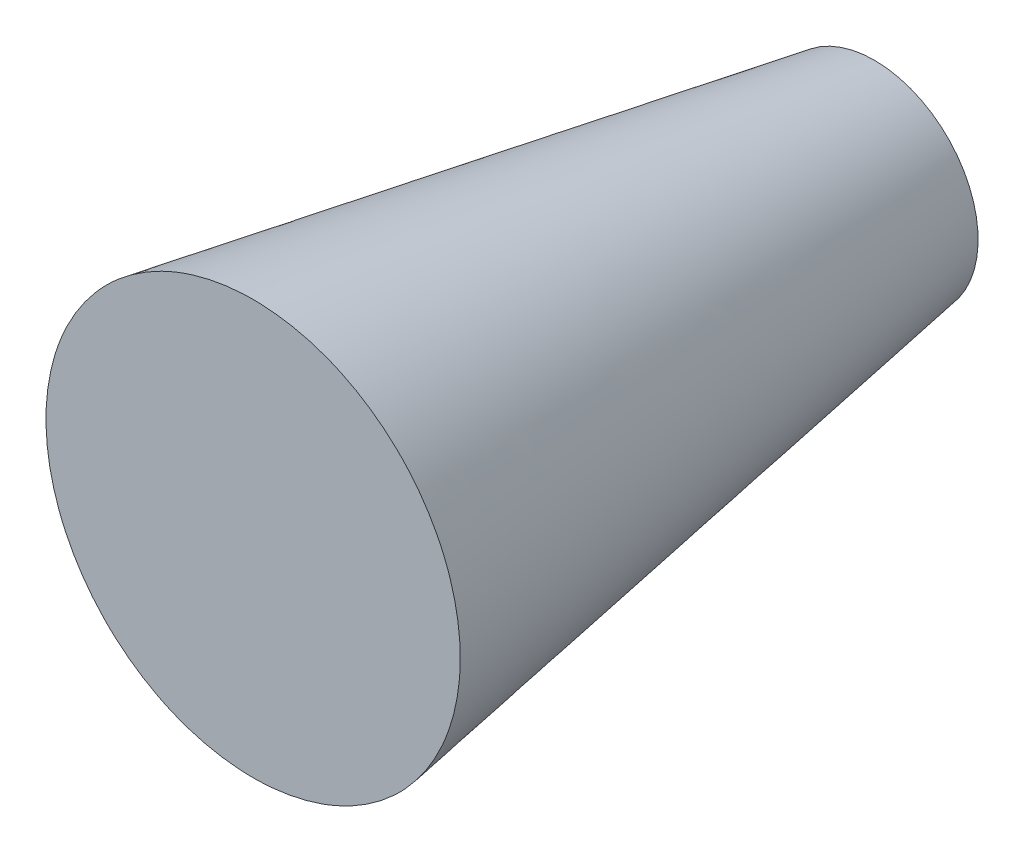
ISO-10303-21;
HEADER;
FILE_DESCRIPTION(('STEP AP214'),'2;1');
FILE_NAME('part.step','',(''),(''),'','','');
FILE_SCHEMA(('AUTOMOTIVE_DESIGN { 1 0 10303 214 1 1 1 1 }'));
ENDSEC;
DATA;
#1=APPLICATION_CONTEXT('core data for automotive mechanical design processes');
#2=APPLICATION_PROTOCOL_DEFINITION('international standard','automotive_design',2000,#1);
#3=PRODUCT_CONTEXT('',#1,'mechanical');
#4=PRODUCT('Part','Part','',(#3));
#5=PRODUCT_RELATED_PRODUCT_CATEGORY('part','',(#4));
#6=PRODUCT_DEFINITION_FORMATION('','',#4);
#7=PRODUCT_DEFINITION_CONTEXT('part definition',#1,'design');
#8=PRODUCT_DEFINITION('design','',#6,#7);
#9=PRODUCT_DEFINITION_SHAPE('','',#8);
#10=(LENGTH_UNIT() NAMED_UNIT(*) SI_UNIT(.MILLI.,.METRE.));
#11=(NAMED_UNIT(*) PLANE_ANGLE_UNIT() SI_UNIT($,.RADIAN.));
#12=(NAMED_UNIT(*) SI_UNIT($,.STERADIAN.) SOLID_ANGLE_UNIT());
#13=UNCERTAINTY_MEASURE_WITH_UNIT(LENGTH_MEASURE(1.E-05),#10,'distance_accuracy_value','');
#14=(GEOMETRIC_REPRESENTATION_CONTEXT(3) GLOBAL_UNCERTAINTY_ASSIGNED_CONTEXT((#13)) GLOBAL_UNIT_ASSIGNED_CONTEXT((#10,
#11,#12)) REPRESENTATION_CONTEXT('',''));
#15=CARTESIAN_POINT('',(0.,0.,0.));
#16=DIRECTION('',(0.,0.,1.));
#17=DIRECTION('',(1.,0.,0.));
#18=AXIS2_PLACEMENT_3D('',#15,#16,#17);
#19=CARTESIAN_POINT('',(0.,0.,30.));
#20=DIRECTION('',(0.,0.,1.));
#21=DIRECTION('',(1.,0.,0.));
#22=AXIS2_PLACEMENT_3D('',#19,#20,#21);
#23=PLANE('',#22);
#24=CARTESIAN_POINT('',(0.,0.,30.));
#25=DIRECTION('',(0.,0.,1.));
#26=DIRECTION('',(1.,0.,0.));
#27=AXIS2_PLACEMENT_3D('',#24,#25,#26);
#28=CIRCLE('',#27,10.);
#29=CARTESIAN_POINT('',(-7.07106781186547,7.07106781186548,30.));
#30=VERTEX_POINT('',#29);
#31=EDGE_CURVE('E11',#30,#30,#28,.T.);
#32=ORIENTED_EDGE('',*,*,#31,.T.);
#33=EDGE_LOOP('',(#32));
#34=FACE_BOUND('',#33,.T.);
#35=ADVANCED_FACE('F53',(#34),#23,.T.);
#36=CARTESIAN_POINT('',(0.,0.,0.));
#37=DIRECTION('',(0.,0.,1.));
#38=DIRECTION('',(1.,0.,0.));
#39=AXIS2_PLACEMENT_3D('',#36,#37,#38);
#40=PLANE('',#39);
#41=CARTESIAN_POINT('',(0.,0.,0.));
#42=DIRECTION('',(0.,0.,1.));
#43=DIRECTION('',(1.,0.,0.));
#44=AXIS2_PLACEMENT_3D('',#41,#42,#43);
#45=CIRCLE('',#44,5.);
#46=CARTESIAN_POINT('',(-3.53553390593274,3.53553390593274,0.));
#47=VERTEX_POINT('',#46);
#48=EDGE_CURVE('E64',#47,#47,#45,.T.);
#49=ORIENTED_EDGE('',*,*,#48,.F.);
#50=EDGE_LOOP('',(#49));
#51=FACE_BOUND('',#50,.T.);
#52=ADVANCED_FACE('F83',(#51),#40,.F.);
#53=CARTESIAN_POINT('',(-3.53553390593274,3.53553390593274,0.));
#54=CARTESIAN_POINT('',(-4.12478955692152,4.12478955692153,5.));
#55=CARTESIAN_POINT('',(-5.3033008588991,5.30330085889911,15.));
#56=CARTESIAN_POINT('',(-6.48181216087668,6.48181216087669,25.));
#57=CARTESIAN_POINT('',(-7.07106781186547,7.07106781186548,30.));
#58=CARTESIAN_POINT('',(-3.99833418397762,3.07273362788786,0.));
#59=CARTESIAN_POINT('',(-4.66472321464055,3.5848558992025,5.));
#60=CARTESIAN_POINT('',(-5.99750127596643,4.60910044183179,15.));
#61=CARTESIAN_POINT('',(-7.3302793372923,5.63334498446107,25.));
#62=CARTESIAN_POINT('',(-7.99666836795523,6.14546725577572,30.));
#63=CARTESIAN_POINT('',(-4.73988137718884,1.96345829272912,0.));
#64=CARTESIAN_POINT('',(-5.52984441641297,2.2907054913173,5.));
#65=CARTESIAN_POINT('',(-7.10977049486122,2.94519988849368,15.));
#66=CARTESIAN_POINT('',(-8.68979714530052,3.59964888312453,25.));
#67=CARTESIAN_POINT('',(-9.47981047052017,3.92687338043996,30.));
#68=CARTESIAN_POINT('',(-5.13030806604431,-4.78705745867933E-05,0.));
#69=CARTESIAN_POINT('',(-5.98539399214664,-8.63489264814751E-05,4.99999999999999));
#70=CARTESIAN_POINT('',(-7.6955658443513,-0.000163305630270839,15.));
#71=CARTESIAN_POINT('',(-9.4055901843523,-0.000156019767836563,25.));
#72=CARTESIAN_POINT('',(-10.2606023543528,-0.000152376836619426,30.));
#73=CARTESIAN_POINT('',(-4.73985411507884,-1.96323651718171,0.));
#74=CARTESIAN_POINT('',(-5.52980336060115,-2.29046388773108,5.00000000000001));
#75=CARTESIAN_POINT('',(-7.10970185164578,-2.94491862882982,15.));
#76=CARTESIAN_POINT('',(-8.6896912043091,-3.59933244698498,25.));
#77=CARTESIAN_POINT('',(-9.47968588064075,-3.92653935606256,30.));
#78=CARTESIAN_POINT('',(-3.6276899097696,-3.62772930082488,0.));
#79=CARTESIAN_POINT('',(-4.23231222339808,-4.23235022147391,4.99999999999999));
#80=CARTESIAN_POINT('',(-5.44155685065504,-5.44159206277197,15.));
#81=CARTESIAN_POINT('',(-6.65077425655753,-6.65081722254467,25.));
#82=CARTESIAN_POINT('',(-7.25538295950878,-7.25542980243101,30.));
#83=CARTESIAN_POINT('',(-1.96329274791161,-4.73981644840214,0.));
#84=CARTESIAN_POINT('',(-2.2905199750829,-5.5297678737538,5.));
#85=CARTESIAN_POINT('',(-2.94497442942548,-7.10967072445712,15.));
#86=CARTESIAN_POINT('',(-3.59939648741167,-8.68965132271249,25.));
#87=CARTESIAN_POINT('',(-3.92660751640476,-9.47964162184016,30.));
#88=CARTESIAN_POINT('',(4.58371486652259E-05,-5.13035866029945,0.));
#89=CARTESIAN_POINT('',(1.40580893779295E-05,-5.98544308759063,5.00000000000001));
#90=CARTESIAN_POINT('',(-4.95000291966634E-05,-7.695611942173,15.));
#91=CARTESIAN_POINT('',(-3.89151037353576E-05,-9.4056460577763,25.));
#92=CARTESIAN_POINT('',(-3.36226410047047E-05,-10.2606631155779,30.));
#93=CARTESIAN_POINT('',(1.9632873482451,-4.73979501728987,0.));
#94=CARTESIAN_POINT('',(2.29051642291841,-5.52976012636071,4.99999999999999));
#95=CARTESIAN_POINT('',(2.94497457226501,-7.1096903445024,15.));
#96=CARTESIAN_POINT('',(3.59940436648306,-8.68969108694635,25.));
#97=CARTESIAN_POINT('',(3.92661926359208,-9.47969145816832,30.0000000000001));
#98=CARTESIAN_POINT('',(3.62775049780074,-3.62775049780076,0.));
#99=CARTESIAN_POINT('',(4.23234856780707,-4.23234856780708,5.00000000000001));
#100=CARTESIAN_POINT('',(5.44154470781973,-5.44154470781972,15.));
#101=CARTESIAN_POINT('',(6.65075833300099,-6.65075833300098,24.9999999999999));
#102=CARTESIAN_POINT('',(7.25536514559162,-7.25536514559161,29.9999999999999));
#103=CARTESIAN_POINT('',(4.73979501728987,-1.96328734824511,0.));
#104=CARTESIAN_POINT('',(5.52976012636071,-2.29051642291841,4.99999999999999));
#105=CARTESIAN_POINT('',(7.10969034450238,-2.94497457226501,15.));
#106=CARTESIAN_POINT('',(8.68969108694632,-3.59940436648309,25.0000000000001));
#107=CARTESIAN_POINT('',(9.47969145816829,-3.92661926359213,30.0000000000002));
#108=CARTESIAN_POINT('',(5.13035866029943,-4.58371486960173E-05,0.));
#109=CARTESIAN_POINT('',(5.98544308759064,-1.40580893950599E-05,5.));
#110=CARTESIAN_POINT('',(7.69561194217305,4.95000292068549E-05,15.));
#111=CARTESIAN_POINT('',(9.40564605777632,3.89151037373092E-05,24.9999999999999));
#112=CARTESIAN_POINT('',(10.260663115578,3.36226410025363E-05,29.9999999999999));
#113=CARTESIAN_POINT('',(4.73981644840215,1.9632927479116,0.));
#114=CARTESIAN_POINT('',(5.52976787375379,2.29051997508289,5.));
#115=CARTESIAN_POINT('',(7.10967072445707,2.94497442942547,15.));
#116=CARTESIAN_POINT('',(8.68965132271246,3.59939648741163,25.0000000000001));
#117=CARTESIAN_POINT('',(9.47964162184016,3.92660751640471,30.0000000000001));
#118=CARTESIAN_POINT('',(3.62772930082489,3.62768990976957,0.));
#119=CARTESIAN_POINT('',(4.23235022147392,4.23231222339806,4.99999999999999));
#120=CARTESIAN_POINT('',(5.44159206277199,5.44155685065505,15.));
#121=CARTESIAN_POINT('',(6.6508172225447,6.65077425655754,24.9999999999999));
#122=CARTESIAN_POINT('',(7.25542980243105,7.25538295950879,29.9999999999999));
#123=CARTESIAN_POINT('',(1.96323651718172,4.73985411507885,0.));
#124=CARTESIAN_POINT('',(2.29046388773109,5.52980336060115,5.00000000000001));
#125=CARTESIAN_POINT('',(2.94491862882983,7.10970185164574,15.));
#126=CARTESIAN_POINT('',(3.59933244698497,8.68969120430907,25.0000000000001));
#127=CARTESIAN_POINT('',(3.92653935606254,9.47968588064074,30.0000000000001));
#128=CARTESIAN_POINT('',(4.78705745998037E-05,5.13030806604429,0.));
#129=CARTESIAN_POINT('',(8.63489264945217E-05,5.98539399214664,4.99999999999999));
#130=CARTESIAN_POINT('',(0.000163305630283958,7.69556584435133,15.));
#131=CARTESIAN_POINT('',(0.000156019767863199,9.40559018435231,25.));
#132=CARTESIAN_POINT('',(0.000152376836652819,10.2606023543528,29.9999999999999));
#133=CARTESIAN_POINT('',(-1.96345829272911,4.73988137718885,0.));
#134=CARTESIAN_POINT('',(-2.2907054913173,5.52984441641298,5.00000000000001));
#135=CARTESIAN_POINT('',(-2.94519988849368,7.10977049486122,15.));
#136=CARTESIAN_POINT('',(-3.59964888312453,8.68979714530053,25.));
#137=CARTESIAN_POINT('',(-3.92687338043996,9.47981047052018,30.));
#138=CARTESIAN_POINT('',(-3.07273362788785,3.99833418397762,0.));
#139=CARTESIAN_POINT('',(-3.5848558992025,4.66472321464056,5.));
#140=CARTESIAN_POINT('',(-4.60910044183178,5.99750127596643,15.));
#141=CARTESIAN_POINT('',(-5.63334498446107,7.33027933729231,25.));
#142=CARTESIAN_POINT('',(-6.14546725577571,7.99666836795524,30.));
#143=CARTESIAN_POINT('',(-3.53553390593274,3.53553390593274,0.));
#144=CARTESIAN_POINT('',(-4.12478955692152,4.12478955692153,5.));
#145=CARTESIAN_POINT('',(-5.3033008588991,5.30330085889911,15.));
#146=CARTESIAN_POINT('',(-6.48181216087668,6.48181216087669,25.));
#147=CARTESIAN_POINT('',(-7.07106781186547,7.07106781186548,30.));
#148=B_SPLINE_SURFACE_WITH_KNOTS('',3,3,((#53,#54,#55,#56,#57),(#58,#59,#60,#61,#62),(#63,#64,
#65,#66,#67),(#68,#69,#70,#71,#72),(#73,#74,#75,#76,#77),(#78,#79,#80,#81,#82),(#83,#84,#85,#86,
#87),(#88,#89,#90,#91,#92),(#93,#94,#95,#96,#97),(#98,#99,#100,#101,#102),(#103,#104,#105,#106,
#107),(#108,#109,#110,#111,#112),(#113,#114,#115,#116,#117),(#118,#119,#120,#121,#122),(#123,
#124,#125,#126,#127),(#128,#129,#130,#131,#132),(#133,#134,#135,#136,#137),(#138,#139,#140,#141,
#142),(#143,#144,#145,#146,#147)),.UNSPECIFIED.,.T.,.F.,.F.,(4,1,1,1,1,1,1,1,1,1,1,1,1,1,1,1,4),
(4,1,4),(0.,0.0625,0.125,0.1875,0.25,0.3125,0.375,0.4375,0.5,0.5625,0.625,0.6875,0.75,0.8125,
0.875,0.9375,1.),(0.,0.5,1.),.UNSPECIFIED.);
#149=CARTESIAN_POINT('',(-3.53553390593274,3.53553390593274,0.));
#150=CARTESIAN_POINT('',(-3.57236238411953,3.57236238411954,0.3125));
#151=CARTESIAN_POINT('',(-3.60919086230633,3.60919086230634,0.625));
#152=CARTESIAN_POINT('',(-3.68284781867993,3.68284781867994,1.25));
#153=CARTESIAN_POINT('',(-3.71967629686673,3.71967629686674,1.5625));
#154=CARTESIAN_POINT('',(-3.79333325324033,3.79333325324033,2.1875));
#155=CARTESIAN_POINT('',(-3.83016173142713,3.83016173142713,2.5));
#156=CARTESIAN_POINT('',(-3.90381868780073,3.90381868780073,3.125));
#157=CARTESIAN_POINT('',(-3.94064716598753,3.94064716598753,3.4375));
#158=CARTESIAN_POINT('',(-4.01430412236113,4.01430412236113,4.0625));
#159=CARTESIAN_POINT('',(-4.05113260054793,4.05113260054793,4.375));
#160=CARTESIAN_POINT('',(-4.12478955692152,4.12478955692153,5.));
#161=CARTESIAN_POINT('',(-4.16161803510832,4.16161803510833,5.3125));
#162=CARTESIAN_POINT('',(-4.23527499148192,4.23527499148193,5.9375));
#163=CARTESIAN_POINT('',(-4.27210346966872,4.27210346966873,6.25));
#164=CARTESIAN_POINT('',(-4.34576042604232,4.34576042604232,6.875));
#165=CARTESIAN_POINT('',(-4.38258890422912,4.38258890422912,7.1875));
#166=CARTESIAN_POINT('',(-4.45624586060272,4.45624586060272,7.8125));
#167=CARTESIAN_POINT('',(-4.49307433878952,4.49307433878952,8.125));
#168=CARTESIAN_POINT('',(-4.56673129516312,4.56673129516312,8.75));
#169=CARTESIAN_POINT('',(-4.60355977334991,4.60355977334992,9.0625));
#170=CARTESIAN_POINT('',(-4.67721672972351,4.67721672972352,9.6875));
#171=CARTESIAN_POINT('',(-4.71404520791031,4.71404520791032,10.));
#172=CARTESIAN_POINT('',(-4.78770216428391,4.78770216428392,10.625));
#173=CARTESIAN_POINT('',(-4.82453064247071,4.82453064247072,10.9375));
#174=CARTESIAN_POINT('',(-4.89818759884431,4.89818759884432,11.5625));
#175=CARTESIAN_POINT('',(-4.93501607703111,4.93501607703112,11.875));
#176=CARTESIAN_POINT('',(-5.00867303340471,5.00867303340471,12.5));
#177=CARTESIAN_POINT('',(-5.04550151159151,5.04550151159151,12.8125));
#178=CARTESIAN_POINT('',(-5.11915846796511,5.11915846796511,13.4375));
#179=CARTESIAN_POINT('',(-5.15598694615191,5.15598694615191,13.75));
#180=CARTESIAN_POINT('',(-5.2296439025255,5.22964390252551,14.375));
#181=CARTESIAN_POINT('',(-5.2664723807123,5.26647238071231,14.6875));
#182=CARTESIAN_POINT('',(-5.3401293370859,5.34012933708591,15.3125));
#183=CARTESIAN_POINT('',(-5.3769578152727,5.37695781527271,15.625));
#184=CARTESIAN_POINT('',(-5.4506147716463,5.45061477164631,16.25));
#185=CARTESIAN_POINT('',(-5.4874432498331,5.4874432498331,16.5625));
#186=CARTESIAN_POINT('',(-5.5611002062067,5.5611002062067,17.1875));
#187=CARTESIAN_POINT('',(-5.5979286843935,5.5979286843935,17.5));
#188=CARTESIAN_POINT('',(-5.6715856407671,5.6715856407671,18.125));
#189=CARTESIAN_POINT('',(-5.7084141189539,5.7084141189539,18.4375));
#190=CARTESIAN_POINT('',(-5.78207107532749,5.7820710753275,19.0625));
#191=CARTESIAN_POINT('',(-5.81889955351429,5.8188995535143,19.375));
#192=CARTESIAN_POINT('',(-5.89255650988789,5.8925565098879,20.));
#193=CARTESIAN_POINT('',(-5.92938498807469,5.9293849880747,20.3125));
#194=CARTESIAN_POINT('',(-6.00304194444829,6.0030419444483,20.9375));
#195=CARTESIAN_POINT('',(-6.03987042263509,6.0398704226351,21.25));
#196=CARTESIAN_POINT('',(-6.11352737900869,6.1135273790087,21.875));
#197=CARTESIAN_POINT('',(-6.15035585719549,6.15035585719549,22.1875));
#198=CARTESIAN_POINT('',(-6.22401281356909,6.22401281356909,22.8125));
#199=CARTESIAN_POINT('',(-6.26084129175588,6.26084129175589,23.125));
#200=CARTESIAN_POINT('',(-6.33449824812948,6.33449824812949,23.75));
#201=CARTESIAN_POINT('',(-6.37132672631628,6.37132672631629,24.0625));
#202=CARTESIAN_POINT('',(-6.44498368268988,6.44498368268989,24.6875));
#203=CARTESIAN_POINT('',(-6.48181216087668,6.48181216087669,25.));
#204=CARTESIAN_POINT('',(-6.55546911725028,6.55546911725029,25.625));
#205=CARTESIAN_POINT('',(-6.59229759543708,6.59229759543709,25.9375));
#206=CARTESIAN_POINT('',(-6.66595455181068,6.66595455181068,26.5625));
#207=CARTESIAN_POINT('',(-6.70278302999748,6.70278302999748,26.875));
#208=CARTESIAN_POINT('',(-6.77643998637108,6.77643998637108,27.5));
#209=CARTESIAN_POINT('',(-6.81326846455788,6.81326846455788,27.8125));
#210=CARTESIAN_POINT('',(-6.88692542093148,6.88692542093148,28.4375));
#211=CARTESIAN_POINT('',(-6.92375389911827,6.92375389911828,28.75));
#212=CARTESIAN_POINT('',(-6.99741085549187,6.99741085549188,29.375));
#213=CARTESIAN_POINT('',(-7.03423933367867,7.03423933367868,29.6875));
#214=CARTESIAN_POINT('',(-7.07106781186547,7.07106781186548,30.));
#215=B_SPLINE_CURVE_WITH_KNOTS('',3,(#149,#150,#151,#152,#153,#154,#155,#156,#157,#158,#159,
#160,#161,#162,#163,#164,#165,#166,#167,#168,#169,#170,#171,#172,#173,#174,#175,#176,#177,#178,
#179,#180,#181,#182,#183,#184,#185,#186,#187,#188,#189,#190,#191,#192,#193,#194,#195,#196,#197,
#198,#199,#200,#201,#202,#203,#204,#205,#206,#207,#208,#209,#210,#211,#212,#213,#214),
.UNSPECIFIED.,.F.,.F.,(4,2,2,2,2,2,2,2,2,2,2,2,2,2,2,2,2,2,2,2,2,2,2,2,2,2,2,2,2,2,2,2,4),(0.,
0.950431645359097,1.90086329071819,2.85129493607729,3.80172658143639,4.75215822679548,
5.70258987215458,6.65302151751368,7.60345316287277,8.55388480823187,9.50431645359096,
10.4547480989501,11.4051797443092,12.3556113896683,13.3060430350274,14.2564746803865,
15.2069063257455,16.1573379711046,17.1077696164637,18.0582012618228,19.0086329071819,
19.959064552541,20.9094961979001,21.8599278432592,22.8103594886183,23.7607911339774,
24.7112227793365,25.6616544246956,26.6120860700547,27.5625177154138,28.5129493607729,
29.463381006132,30.4138126514911),.UNSPECIFIED.);
#216=EDGE_CURVE('BSEAM91',#47,#30,#215,.T.);
#217=ORIENTED_EDGE('',*,*,#48,.T.);
#218=ORIENTED_EDGE('',*,*,#31,.F.);
#219=ORIENTED_EDGE('',*,*,#216,.T.);
#220=ORIENTED_EDGE('',*,*,#216,.F.);
#221=EDGE_LOOP('',(#217,#219,#218,#220));
#222=FACE_BOUND('',#221,.T.);
#223=ADVANCED_FACE('F91',(#222),#148,.T.);
#224=CLOSED_SHELL('',(#35,#52,#223));
#225=MANIFOLD_SOLID_BREP('B2',#224);
#226=ADVANCED_BREP_SHAPE_REPRESENTATION('',(#18,#225),#14);
#227=SHAPE_DEFINITION_REPRESENTATION(#9,#226);
ENDSEC;
END-ISO-10303-21;
